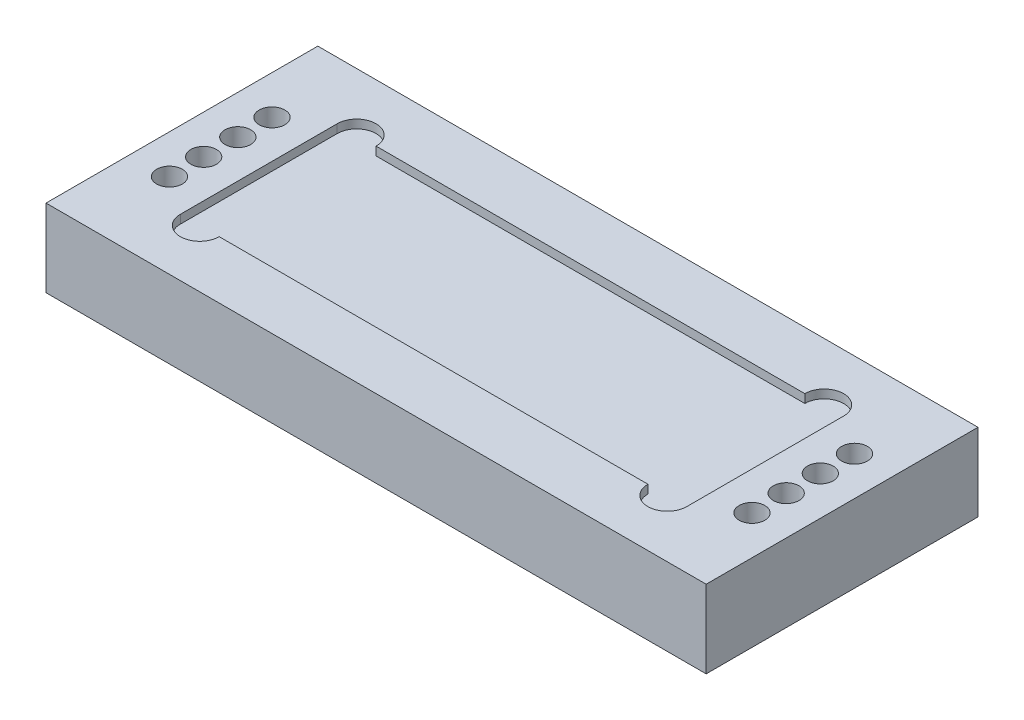
ISO-10303-21;
HEADER;
FILE_DESCRIPTION(('STEP AP214'),'2;1');
FILE_NAME('part.step','',(''),(''),'','','');
FILE_SCHEMA(('AUTOMOTIVE_DESIGN { 1 0 10303 214 1 1 1 1 }'));
ENDSEC;
DATA;
#1=APPLICATION_CONTEXT('core data for automotive mechanical design processes');
#2=APPLICATION_PROTOCOL_DEFINITION('international standard','automotive_design',2000,#1);
#3=PRODUCT_CONTEXT('',#1,'mechanical');
#4=PRODUCT('Part','Part','',(#3));
#5=PRODUCT_RELATED_PRODUCT_CATEGORY('part','',(#4));
#6=PRODUCT_DEFINITION_FORMATION('','',#4);
#7=PRODUCT_DEFINITION_CONTEXT('part definition',#1,'design');
#8=PRODUCT_DEFINITION('design','',#6,#7);
#9=PRODUCT_DEFINITION_SHAPE('','',#8);
#10=(LENGTH_UNIT() NAMED_UNIT(*) SI_UNIT(.MILLI.,.METRE.));
#11=(NAMED_UNIT(*) PLANE_ANGLE_UNIT() SI_UNIT($,.RADIAN.));
#12=(NAMED_UNIT(*) SI_UNIT($,.STERADIAN.) SOLID_ANGLE_UNIT());
#13=UNCERTAINTY_MEASURE_WITH_UNIT(LENGTH_MEASURE(1.E-05),#10,'distance_accuracy_value','');
#14=(GEOMETRIC_REPRESENTATION_CONTEXT(3) GLOBAL_UNCERTAINTY_ASSIGNED_CONTEXT((#13)) GLOBAL_UNIT_ASSIGNED_CONTEXT((#10,
#11,#12)) REPRESENTATION_CONTEXT('',''));
#15=CARTESIAN_POINT('',(0.,0.,0.));
#16=DIRECTION('',(0.,0.,1.));
#17=DIRECTION('',(1.,0.,0.));
#18=AXIS2_PLACEMENT_3D('',#15,#16,#17);
#19=CARTESIAN_POINT('',(-53.975,-12.7,-22.225));
#20=DIRECTION('',(-1.,0.,0.));
#21=DIRECTION('',(0.,0.,1.));
#22=AXIS2_PLACEMENT_3D('',#19,#20,#21);
#23=PLANE('',#22);
#24=DIRECTION('',(0.,0.,1.));
#25=VECTOR('',#24,1.);
#26=CARTESIAN_POINT('',(-53.975,0.,-22.225));
#27=LINE('',#26,#25);
#28=CARTESIAN_POINT('',(-53.975,0.,-22.225));
#29=VERTEX_POINT('',#28);
#30=CARTESIAN_POINT('',(-53.975,0.,22.225));
#31=VERTEX_POINT('',#30);
#32=EDGE_CURVE('E193',#29,#31,#27,.T.);
#33=ORIENTED_EDGE('',*,*,#32,.F.);
#34=DIRECTION('',(0.,1.,0.));
#35=VECTOR('',#34,1.);
#36=CARTESIAN_POINT('',(-53.975,-12.7,-22.225));
#37=LINE('',#36,#35);
#38=CARTESIAN_POINT('',(-53.975,-12.7,-22.225));
#39=VERTEX_POINT('',#38);
#40=EDGE_CURVE('E11',#39,#29,#37,.T.);
#41=ORIENTED_EDGE('',*,*,#40,.F.);
#42=DIRECTION('',(0.,0.,1.));
#43=VECTOR('',#42,1.);
#44=CARTESIAN_POINT('',(-53.975,-12.7,-22.225));
#45=LINE('',#44,#43);
#46=CARTESIAN_POINT('',(-53.975,-12.7,22.225));
#47=VERTEX_POINT('',#46);
#48=EDGE_CURVE('E205',#39,#47,#45,.T.);
#49=ORIENTED_EDGE('',*,*,#48,.T.);
#50=DIRECTION('',(0.,1.,0.));
#51=VECTOR('',#50,1.);
#52=CARTESIAN_POINT('',(-53.975,-12.7,22.225));
#53=LINE('',#52,#51);
#54=EDGE_CURVE('E38',#47,#31,#53,.T.);
#55=ORIENTED_EDGE('',*,*,#54,.T.);
#56=EDGE_LOOP('',(#33,#41,#49,#55));
#57=FACE_BOUND('',#56,.T.);
#58=ADVANCED_FACE('F35',(#57),#23,.T.);
#59=CARTESIAN_POINT('',(-53.975,-12.7,-22.225));
#60=DIRECTION('',(0.,0.,-1.));
#61=DIRECTION('',(-1.,0.,0.));
#62=AXIS2_PLACEMENT_3D('',#59,#60,#61);
#63=PLANE('',#62);
#64=DIRECTION('',(-1.,0.,0.));
#65=VECTOR('',#64,1.);
#66=CARTESIAN_POINT('',(-53.975,0.,-22.225));
#67=LINE('',#66,#65);
#68=CARTESIAN_POINT('',(53.975,0.,-22.225));
#69=VERTEX_POINT('',#68);
#70=EDGE_CURVE('E208',#69,#29,#67,.T.);
#71=ORIENTED_EDGE('',*,*,#70,.F.);
#72=DIRECTION('',(0.,1.,0.));
#73=VECTOR('',#72,1.);
#74=CARTESIAN_POINT('',(53.975,-12.7,-22.225));
#75=LINE('',#74,#73);
#76=CARTESIAN_POINT('',(53.975,-12.7,-22.225));
#77=VERTEX_POINT('',#76);
#78=EDGE_CURVE('E43',#77,#69,#75,.T.);
#79=ORIENTED_EDGE('',*,*,#78,.F.);
#80=DIRECTION('',(-1.,0.,0.));
#81=VECTOR('',#80,1.);
#82=CARTESIAN_POINT('',(-53.975,-12.7,-22.225));
#83=LINE('',#82,#81);
#84=EDGE_CURVE('E213',#77,#39,#83,.T.);
#85=ORIENTED_EDGE('',*,*,#84,.T.);
#86=ORIENTED_EDGE('',*,*,#40,.T.);
#87=EDGE_LOOP('',(#71,#79,#85,#86));
#88=FACE_BOUND('',#87,.T.);
#89=ADVANCED_FACE('F230',(#88),#63,.T.);
#90=CARTESIAN_POINT('',(53.975,-12.7,-22.225));
#91=DIRECTION('',(1.,0.,0.));
#92=DIRECTION('',(0.,0.,-1.));
#93=AXIS2_PLACEMENT_3D('',#90,#91,#92);
#94=PLANE('',#93);
#95=DIRECTION('',(0.,0.,-1.));
#96=VECTOR('',#95,1.);
#97=CARTESIAN_POINT('',(53.975,0.,-22.225));
#98=LINE('',#97,#96);
#99=CARTESIAN_POINT('',(53.975,0.,22.225));
#100=VERTEX_POINT('',#99);
#101=EDGE_CURVE('E220',#100,#69,#98,.T.);
#102=ORIENTED_EDGE('',*,*,#101,.F.);
#103=DIRECTION('',(0.,1.,0.));
#104=VECTOR('',#103,1.);
#105=CARTESIAN_POINT('',(53.975,-12.7,22.225));
#106=LINE('',#105,#104);
#107=CARTESIAN_POINT('',(53.975,-12.7,22.225));
#108=VERTEX_POINT('',#107);
#109=EDGE_CURVE('E225',#108,#100,#106,.T.);
#110=ORIENTED_EDGE('',*,*,#109,.F.);
#111=DIRECTION('',(0.,0.,-1.));
#112=VECTOR('',#111,1.);
#113=CARTESIAN_POINT('',(53.975,-12.7,-22.225));
#114=LINE('',#113,#112);
#115=EDGE_CURVE('E210',#108,#77,#114,.T.);
#116=ORIENTED_EDGE('',*,*,#115,.T.);
#117=ORIENTED_EDGE('',*,*,#78,.T.);
#118=EDGE_LOOP('',(#102,#110,#116,#117));
#119=FACE_BOUND('',#118,.T.);
#120=ADVANCED_FACE('F234',(#119),#94,.T.);
#121=CARTESIAN_POINT('',(-53.975,-12.7,22.225));
#122=DIRECTION('',(0.,0.,1.));
#123=DIRECTION('',(1.,0.,0.));
#124=AXIS2_PLACEMENT_3D('',#121,#122,#123);
#125=PLANE('',#124);
#126=DIRECTION('',(1.,0.,0.));
#127=VECTOR('',#126,1.);
#128=CARTESIAN_POINT('',(-53.975,0.,22.225));
#129=LINE('',#128,#127);
#130=EDGE_CURVE('E217',#31,#100,#129,.T.);
#131=ORIENTED_EDGE('',*,*,#130,.F.);
#132=ORIENTED_EDGE('',*,*,#54,.F.);
#133=DIRECTION('',(1.,0.,0.));
#134=VECTOR('',#133,1.);
#135=CARTESIAN_POINT('',(-53.975,-12.7,22.225));
#136=LINE('',#135,#134);
#137=EDGE_CURVE('E207',#47,#108,#136,.T.);
#138=ORIENTED_EDGE('',*,*,#137,.T.);
#139=ORIENTED_EDGE('',*,*,#109,.T.);
#140=EDGE_LOOP('',(#131,#132,#138,#139));
#141=FACE_BOUND('',#140,.T.);
#142=ADVANCED_FACE('F227',(#141),#125,.T.);
#143=CARTESIAN_POINT('',(0.,-12.7,0.));
#144=DIRECTION('',(0.,1.,0.));
#145=DIRECTION('',(0.,0.,1.));
#146=AXIS2_PLACEMENT_3D('',#143,#144,#145);
#147=PLANE('',#146);
#148=CARTESIAN_POINT('',(-47.625,-12.7,-8.382));
#149=DIRECTION('',(0.,1.,0.));
#150=DIRECTION('',(0.,0.,1.));
#151=AXIS2_PLACEMENT_3D('',#148,#149,#150);
#152=CIRCLE('',#151,2.1);
#153=CARTESIAN_POINT('',(-47.625,-12.7,-6.282));
#154=VERTEX_POINT('',#153);
#155=EDGE_CURVE('E459',#154,#154,#152,.T.);
#156=ORIENTED_EDGE('',*,*,#155,.T.);
#157=EDGE_LOOP('',(#156));
#158=FACE_BOUND('',#157,.T.);
#159=CARTESIAN_POINT('',(-47.625,-12.7,-2.794));
#160=DIRECTION('',(0.,1.,0.));
#161=DIRECTION('',(0.,0.,1.));
#162=AXIS2_PLACEMENT_3D('',#159,#160,#161);
#163=CIRCLE('',#162,2.1);
#164=CARTESIAN_POINT('',(-47.625,-12.7,-0.693999999999999));
#165=VERTEX_POINT('',#164);
#166=EDGE_CURVE('E469',#165,#165,#163,.T.);
#167=ORIENTED_EDGE('',*,*,#166,.T.);
#168=EDGE_LOOP('',(#167));
#169=FACE_BOUND('',#168,.T.);
#170=CARTESIAN_POINT('',(-47.625,-12.7,2.794));
#171=DIRECTION('',(0.,1.,0.));
#172=DIRECTION('',(0.,0.,1.));
#173=AXIS2_PLACEMENT_3D('',#170,#171,#172);
#174=CIRCLE('',#173,2.1);
#175=CARTESIAN_POINT('',(-47.625,-12.7,4.894));
#176=VERTEX_POINT('',#175);
#177=EDGE_CURVE('E475',#176,#176,#174,.T.);
#178=ORIENTED_EDGE('',*,*,#177,.T.);
#179=EDGE_LOOP('',(#178));
#180=FACE_BOUND('',#179,.T.);
#181=CARTESIAN_POINT('',(-47.625,-12.7,8.382));
#182=DIRECTION('',(0.,1.,0.));
#183=DIRECTION('',(0.,0.,1.));
#184=AXIS2_PLACEMENT_3D('',#181,#182,#183);
#185=CIRCLE('',#184,2.1);
#186=CARTESIAN_POINT('',(-47.625,-12.7,10.482));
#187=VERTEX_POINT('',#186);
#188=EDGE_CURVE('E481',#187,#187,#185,.T.);
#189=ORIENTED_EDGE('',*,*,#188,.T.);
#190=EDGE_LOOP('',(#189));
#191=FACE_BOUND('',#190,.T.);
#192=CARTESIAN_POINT('',(47.625,-12.7,8.382));
#193=DIRECTION('',(0.,1.,0.));
#194=DIRECTION('',(0.,0.,1.));
#195=AXIS2_PLACEMENT_3D('',#192,#193,#194);
#196=CIRCLE('',#195,2.1);
#197=CARTESIAN_POINT('',(47.625,-12.7,10.482));
#198=VERTEX_POINT('',#197);
#199=EDGE_CURVE('E487',#198,#198,#196,.T.);
#200=ORIENTED_EDGE('',*,*,#199,.T.);
#201=EDGE_LOOP('',(#200));
#202=FACE_BOUND('',#201,.T.);
#203=CARTESIAN_POINT('',(47.625,-12.7,2.794));
#204=DIRECTION('',(0.,1.,0.));
#205=DIRECTION('',(0.,0.,1.));
#206=AXIS2_PLACEMENT_3D('',#203,#204,#205);
#207=CIRCLE('',#206,2.1);
#208=CARTESIAN_POINT('',(47.625,-12.7,4.894));
#209=VERTEX_POINT('',#208);
#210=EDGE_CURVE('E493',#209,#209,#207,.T.);
#211=ORIENTED_EDGE('',*,*,#210,.T.);
#212=EDGE_LOOP('',(#211));
#213=FACE_BOUND('',#212,.T.);
#214=CARTESIAN_POINT('',(47.625,-12.7,-2.794));
#215=DIRECTION('',(0.,1.,0.));
#216=DIRECTION('',(0.,0.,1.));
#217=AXIS2_PLACEMENT_3D('',#214,#215,#216);
#218=CIRCLE('',#217,2.1);
#219=CARTESIAN_POINT('',(47.625,-12.7,-0.693999999999999));
#220=VERTEX_POINT('',#219);
#221=EDGE_CURVE('E499',#220,#220,#218,.T.);
#222=ORIENTED_EDGE('',*,*,#221,.T.);
#223=EDGE_LOOP('',(#222));
#224=FACE_BOUND('',#223,.T.);
#225=CARTESIAN_POINT('',(47.625,-12.7,-8.382));
#226=DIRECTION('',(0.,1.,0.));
#227=DIRECTION('',(0.,0.,1.));
#228=AXIS2_PLACEMENT_3D('',#225,#226,#227);
#229=CIRCLE('',#228,2.1);
#230=CARTESIAN_POINT('',(47.625,-12.7,-6.282));
#231=VERTEX_POINT('',#230);
#232=EDGE_CURVE('E158',#231,#231,#229,.T.);
#233=ORIENTED_EDGE('',*,*,#232,.T.);
#234=EDGE_LOOP('',(#233));
#235=FACE_BOUND('',#234,.T.);
#236=ORIENTED_EDGE('',*,*,#48,.F.);
#237=ORIENTED_EDGE('',*,*,#84,.F.);
#238=ORIENTED_EDGE('',*,*,#115,.F.);
#239=ORIENTED_EDGE('',*,*,#137,.F.);
#240=EDGE_LOOP('',(#236,#237,#238,#239));
#241=FACE_BOUND('',#240,.T.);
#242=ADVANCED_FACE('F236',(#158,#169,#180,#191,#202,#213,#224,#235,#241),#147,.F.);
#243=CARTESIAN_POINT('',(0.,0.,0.));
#244=DIRECTION('',(0.,1.,0.));
#245=DIRECTION('',(0.,0.,1.));
#246=AXIS2_PLACEMENT_3D('',#243,#244,#245);
#247=PLANE('',#246);
#248=CARTESIAN_POINT('',(-47.625,0.,-8.382));
#249=DIRECTION('',(0.,1.,0.));
#250=DIRECTION('',(0.,0.,1.));
#251=AXIS2_PLACEMENT_3D('',#248,#249,#250);
#252=CIRCLE('',#251,2.1);
#253=CARTESIAN_POINT('',(-47.625,0.,-6.282));
#254=VERTEX_POINT('',#253);
#255=EDGE_CURVE('E462',#254,#254,#252,.T.);
#256=ORIENTED_EDGE('',*,*,#255,.F.);
#257=EDGE_LOOP('',(#256));
#258=FACE_BOUND('',#257,.T.);
#259=CARTESIAN_POINT('',(-47.625,0.,-2.794));
#260=DIRECTION('',(0.,1.,0.));
#261=DIRECTION('',(0.,0.,1.));
#262=AXIS2_PLACEMENT_3D('',#259,#260,#261);
#263=CIRCLE('',#262,2.1);
#264=CARTESIAN_POINT('',(-47.625,0.,-0.693999999999999));
#265=VERTEX_POINT('',#264);
#266=EDGE_CURVE('E464',#265,#265,#263,.T.);
#267=ORIENTED_EDGE('',*,*,#266,.F.);
#268=EDGE_LOOP('',(#267));
#269=FACE_BOUND('',#268,.T.);
#270=CARTESIAN_POINT('',(-47.625,0.,2.794));
#271=DIRECTION('',(0.,1.,0.));
#272=DIRECTION('',(0.,0.,1.));
#273=AXIS2_PLACEMENT_3D('',#270,#271,#272);
#274=CIRCLE('',#273,2.1);
#275=CARTESIAN_POINT('',(-47.625,0.,4.894));
#276=VERTEX_POINT('',#275);
#277=EDGE_CURVE('E472',#276,#276,#274,.T.);
#278=ORIENTED_EDGE('',*,*,#277,.F.);
#279=EDGE_LOOP('',(#278));
#280=FACE_BOUND('',#279,.T.);
#281=CARTESIAN_POINT('',(-47.625,0.,8.382));
#282=DIRECTION('',(0.,1.,0.));
#283=DIRECTION('',(0.,0.,1.));
#284=AXIS2_PLACEMENT_3D('',#281,#282,#283);
#285=CIRCLE('',#284,2.1);
#286=CARTESIAN_POINT('',(-47.625,0.,10.482));
#287=VERTEX_POINT('',#286);
#288=EDGE_CURVE('E478',#287,#287,#285,.T.);
#289=ORIENTED_EDGE('',*,*,#288,.F.);
#290=EDGE_LOOP('',(#289));
#291=FACE_BOUND('',#290,.T.);
#292=CARTESIAN_POINT('',(47.625,0.,8.382));
#293=DIRECTION('',(0.,1.,0.));
#294=DIRECTION('',(0.,0.,1.));
#295=AXIS2_PLACEMENT_3D('',#292,#293,#294);
#296=CIRCLE('',#295,2.1);
#297=CARTESIAN_POINT('',(47.625,0.,10.482));
#298=VERTEX_POINT('',#297);
#299=EDGE_CURVE('E484',#298,#298,#296,.T.);
#300=ORIENTED_EDGE('',*,*,#299,.F.);
#301=EDGE_LOOP('',(#300));
#302=FACE_BOUND('',#301,.T.);
#303=CARTESIAN_POINT('',(47.625,0.,2.794));
#304=DIRECTION('',(0.,1.,0.));
#305=DIRECTION('',(0.,0.,1.));
#306=AXIS2_PLACEMENT_3D('',#303,#304,#305);
#307=CIRCLE('',#306,2.1);
#308=CARTESIAN_POINT('',(47.625,0.,4.894));
#309=VERTEX_POINT('',#308);
#310=EDGE_CURVE('E490',#309,#309,#307,.T.);
#311=ORIENTED_EDGE('',*,*,#310,.F.);
#312=EDGE_LOOP('',(#311));
#313=FACE_BOUND('',#312,.T.);
#314=CARTESIAN_POINT('',(47.625,0.,-2.794));
#315=DIRECTION('',(0.,1.,0.));
#316=DIRECTION('',(0.,0.,1.));
#317=AXIS2_PLACEMENT_3D('',#314,#315,#316);
#318=CIRCLE('',#317,2.1);
#319=CARTESIAN_POINT('',(47.625,0.,-0.693999999999999));
#320=VERTEX_POINT('',#319);
#321=EDGE_CURVE('E496',#320,#320,#318,.T.);
#322=ORIENTED_EDGE('',*,*,#321,.F.);
#323=EDGE_LOOP('',(#322));
#324=FACE_BOUND('',#323,.T.);
#325=CARTESIAN_POINT('',(47.625,0.,-8.382));
#326=DIRECTION('',(0.,1.,0.));
#327=DIRECTION('',(0.,0.,1.));
#328=AXIS2_PLACEMENT_3D('',#325,#326,#327);
#329=CIRCLE('',#328,2.1);
#330=CARTESIAN_POINT('',(47.625,0.,-6.282));
#331=VERTEX_POINT('',#330);
#332=EDGE_CURVE('E501',#331,#331,#329,.T.);
#333=ORIENTED_EDGE('',*,*,#332,.F.);
#334=EDGE_LOOP('',(#333));
#335=FACE_BOUND('',#334,.T.);
#336=CARTESIAN_POINT('',(38.227,0.,-12.827));
#337=DIRECTION('',(0.,1.,0.));
#338=DIRECTION('',(0.,0.,1.));
#339=AXIS2_PLACEMENT_3D('',#336,#337,#338);
#340=CIRCLE('',#339,3.175);
#341=CARTESIAN_POINT('',(41.402,0.,-12.827));
#342=VERTEX_POINT('',#341);
#343=CARTESIAN_POINT('',(35.052,0.,-12.827));
#344=VERTEX_POINT('',#343);
#345=EDGE_CURVE('E51',#342,#344,#340,.T.);
#346=ORIENTED_EDGE('',*,*,#345,.F.);
#347=DIRECTION('',(0.,0.,-1.));
#348=VECTOR('',#347,1.);
#349=CARTESIAN_POINT('',(41.402,0.,-12.827));
#350=LINE('',#349,#348);
#351=CARTESIAN_POINT('',(41.402,0.,12.827));
#352=VERTEX_POINT('',#351);
#353=EDGE_CURVE('E152',#352,#342,#350,.T.);
#354=ORIENTED_EDGE('',*,*,#353,.F.);
#355=CARTESIAN_POINT('',(38.227,0.,12.827));
#356=DIRECTION('',(0.,1.,0.));
#357=DIRECTION('',(0.,0.,1.));
#358=AXIS2_PLACEMENT_3D('',#355,#356,#357);
#359=CIRCLE('',#358,3.175);
#360=CARTESIAN_POINT('',(35.052,0.,12.827));
#361=VERTEX_POINT('',#360);
#362=EDGE_CURVE('E155',#361,#352,#359,.T.);
#363=ORIENTED_EDGE('',*,*,#362,.F.);
#364=DIRECTION('',(1.,0.,0.));
#365=VECTOR('',#364,1.);
#366=CARTESIAN_POINT('',(-35.052,0.,12.827));
#367=LINE('',#366,#365);
#368=CARTESIAN_POINT('',(-35.052,0.,12.827));
#369=VERTEX_POINT('',#368);
#370=EDGE_CURVE('E186',#369,#361,#367,.T.);
#371=ORIENTED_EDGE('',*,*,#370,.F.);
#372=CARTESIAN_POINT('',(-38.227,0.,12.827));
#373=DIRECTION('',(0.,1.,0.));
#374=DIRECTION('',(0.,0.,1.));
#375=AXIS2_PLACEMENT_3D('',#372,#373,#374);
#376=CIRCLE('',#375,3.175);
#377=CARTESIAN_POINT('',(-41.402,0.,12.827));
#378=VERTEX_POINT('',#377);
#379=EDGE_CURVE('E183',#378,#369,#376,.T.);
#380=ORIENTED_EDGE('',*,*,#379,.F.);
#381=DIRECTION('',(0.,0.,1.));
#382=VECTOR('',#381,1.);
#383=CARTESIAN_POINT('',(-41.402,0.,-12.827));
#384=LINE('',#383,#382);
#385=CARTESIAN_POINT('',(-41.402,0.,-12.827));
#386=VERTEX_POINT('',#385);
#387=EDGE_CURVE('E180',#386,#378,#384,.T.);
#388=ORIENTED_EDGE('',*,*,#387,.F.);
#389=CARTESIAN_POINT('',(-38.227,0.,-12.827));
#390=DIRECTION('',(0.,1.,0.));
#391=DIRECTION('',(0.,0.,1.));
#392=AXIS2_PLACEMENT_3D('',#389,#390,#391);
#393=CIRCLE('',#392,3.175);
#394=CARTESIAN_POINT('',(-35.052,0.,-12.827));
#395=VERTEX_POINT('',#394);
#396=EDGE_CURVE('E177',#395,#386,#393,.T.);
#397=ORIENTED_EDGE('',*,*,#396,.F.);
#398=DIRECTION('',(-1.,0.,0.));
#399=VECTOR('',#398,1.);
#400=CARTESIAN_POINT('',(-35.052,0.,-12.827));
#401=LINE('',#400,#399);
#402=EDGE_CURVE('E175',#344,#395,#401,.T.);
#403=ORIENTED_EDGE('',*,*,#402,.F.);
#404=EDGE_LOOP('',(#346,#354,#363,#371,#380,#388,#397,#403));
#405=FACE_BOUND('',#404,.T.);
#406=ORIENTED_EDGE('',*,*,#32,.T.);
#407=ORIENTED_EDGE('',*,*,#130,.T.);
#408=ORIENTED_EDGE('',*,*,#101,.T.);
#409=ORIENTED_EDGE('',*,*,#70,.T.);
#410=EDGE_LOOP('',(#406,#407,#408,#409));
#411=FACE_BOUND('',#410,.T.);
#412=ADVANCED_FACE('F229',(#258,#269,#280,#291,#302,#313,#324,#335,#405,#411),#247,.T.);
#413=CARTESIAN_POINT('',(38.227,-1.397,-12.827));
#414=DIRECTION('',(0.,1.,0.));
#415=DIRECTION('',(0.,0.,1.));
#416=AXIS2_PLACEMENT_3D('',#413,#414,#415);
#417=CYLINDRICAL_SURFACE('',#416,3.175);
#418=ORIENTED_EDGE('',*,*,#345,.T.);
#419=DIRECTION('',(0.,1.,0.));
#420=VECTOR('',#419,1.);
#421=CARTESIAN_POINT('',(35.052,-1.397,-12.827));
#422=LINE('',#421,#420);
#423=CARTESIAN_POINT('',(35.052,-1.397,-12.827));
#424=VERTEX_POINT('',#423);
#425=EDGE_CURVE('E129',#424,#344,#422,.T.);
#426=ORIENTED_EDGE('',*,*,#425,.F.);
#427=CARTESIAN_POINT('',(38.227,-1.397,-12.827));
#428=DIRECTION('',(0.,1.,0.));
#429=DIRECTION('',(0.,0.,1.));
#430=AXIS2_PLACEMENT_3D('',#427,#428,#429);
#431=CIRCLE('',#430,3.175);
#432=CARTESIAN_POINT('',(41.402,-1.397,-12.827));
#433=VERTEX_POINT('',#432);
#434=EDGE_CURVE('E133',#433,#424,#431,.T.);
#435=ORIENTED_EDGE('',*,*,#434,.F.);
#436=DIRECTION('',(0.,1.,0.));
#437=VECTOR('',#436,1.);
#438=CARTESIAN_POINT('',(41.402,-1.397,-12.827));
#439=LINE('',#438,#437);
#440=EDGE_CURVE('E191',#433,#342,#439,.T.);
#441=ORIENTED_EDGE('',*,*,#440,.T.);
#442=EDGE_LOOP('',(#418,#426,#435,#441));
#443=FACE_BOUND('',#442,.T.);
#444=ADVANCED_FACE('F131',(#443),#417,.F.);
#445=CARTESIAN_POINT('',(41.402,-1.397,-12.827));
#446=DIRECTION('',(1.,0.,0.));
#447=DIRECTION('',(0.,0.,-1.));
#448=AXIS2_PLACEMENT_3D('',#445,#446,#447);
#449=PLANE('',#448);
#450=ORIENTED_EDGE('',*,*,#353,.T.);
#451=ORIENTED_EDGE('',*,*,#440,.F.);
#452=DIRECTION('',(0.,0.,-1.));
#453=VECTOR('',#452,1.);
#454=CARTESIAN_POINT('',(41.402,-1.397,-12.827));
#455=LINE('',#454,#453);
#456=CARTESIAN_POINT('',(41.402,-1.397,12.827));
#457=VERTEX_POINT('',#456);
#458=EDGE_CURVE('E139',#457,#433,#455,.T.);
#459=ORIENTED_EDGE('',*,*,#458,.F.);
#460=DIRECTION('',(0.,1.,0.));
#461=VECTOR('',#460,1.);
#462=CARTESIAN_POINT('',(41.402,-1.397,12.827));
#463=LINE('',#462,#461);
#464=EDGE_CURVE('E194',#457,#352,#463,.T.);
#465=ORIENTED_EDGE('',*,*,#464,.T.);
#466=EDGE_LOOP('',(#450,#451,#459,#465));
#467=FACE_BOUND('',#466,.T.);
#468=ADVANCED_FACE('F274',(#467),#449,.F.);
#469=CARTESIAN_POINT('',(38.227,-1.397,12.827));
#470=DIRECTION('',(0.,1.,0.));
#471=DIRECTION('',(0.,0.,1.));
#472=AXIS2_PLACEMENT_3D('',#469,#470,#471);
#473=CYLINDRICAL_SURFACE('',#472,3.175);
#474=ORIENTED_EDGE('',*,*,#362,.T.);
#475=ORIENTED_EDGE('',*,*,#464,.F.);
#476=CARTESIAN_POINT('',(38.227,-1.397,12.827));
#477=DIRECTION('',(0.,1.,0.));
#478=DIRECTION('',(0.,0.,1.));
#479=AXIS2_PLACEMENT_3D('',#476,#477,#478);
#480=CIRCLE('',#479,3.175);
#481=CARTESIAN_POINT('',(35.052,-1.397,12.827));
#482=VERTEX_POINT('',#481);
#483=EDGE_CURVE('E171',#482,#457,#480,.T.);
#484=ORIENTED_EDGE('',*,*,#483,.F.);
#485=DIRECTION('',(0.,1.,0.));
#486=VECTOR('',#485,1.);
#487=CARTESIAN_POINT('',(35.052,-1.397,12.827));
#488=LINE('',#487,#486);
#489=EDGE_CURVE('E196',#482,#361,#488,.T.);
#490=ORIENTED_EDGE('',*,*,#489,.T.);
#491=EDGE_LOOP('',(#474,#475,#484,#490));
#492=FACE_BOUND('',#491,.T.);
#493=ADVANCED_FACE('F283',(#492),#473,.F.);
#494=CARTESIAN_POINT('',(-35.052,-1.397,12.827));
#495=DIRECTION('',(0.,0.,1.));
#496=DIRECTION('',(1.,0.,0.));
#497=AXIS2_PLACEMENT_3D('',#494,#495,#496);
#498=PLANE('',#497);
#499=ORIENTED_EDGE('',*,*,#370,.T.);
#500=ORIENTED_EDGE('',*,*,#489,.F.);
#501=DIRECTION('',(1.,0.,0.));
#502=VECTOR('',#501,1.);
#503=CARTESIAN_POINT('',(-35.052,-1.397,12.827));
#504=LINE('',#503,#502);
#505=CARTESIAN_POINT('',(-35.052,-1.397,12.827));
#506=VERTEX_POINT('',#505);
#507=EDGE_CURVE('E168',#506,#482,#504,.T.);
#508=ORIENTED_EDGE('',*,*,#507,.F.);
#509=DIRECTION('',(0.,1.,0.));
#510=VECTOR('',#509,1.);
#511=CARTESIAN_POINT('',(-35.052,-1.397,12.827));
#512=LINE('',#511,#510);
#513=EDGE_CURVE('E198',#506,#369,#512,.T.);
#514=ORIENTED_EDGE('',*,*,#513,.T.);
#515=EDGE_LOOP('',(#499,#500,#508,#514));
#516=FACE_BOUND('',#515,.T.);
#517=ADVANCED_FACE('F293',(#516),#498,.F.);
#518=CARTESIAN_POINT('',(-38.227,-1.397,12.827));
#519=DIRECTION('',(0.,1.,0.));
#520=DIRECTION('',(0.,0.,1.));
#521=AXIS2_PLACEMENT_3D('',#518,#519,#520);
#522=CYLINDRICAL_SURFACE('',#521,3.175);
#523=ORIENTED_EDGE('',*,*,#379,.T.);
#524=ORIENTED_EDGE('',*,*,#513,.F.);
#525=CARTESIAN_POINT('',(-38.227,-1.397,12.827));
#526=DIRECTION('',(0.,1.,0.));
#527=DIRECTION('',(0.,0.,1.));
#528=AXIS2_PLACEMENT_3D('',#525,#526,#527);
#529=CIRCLE('',#528,3.175);
#530=CARTESIAN_POINT('',(-41.402,-1.397,12.827));
#531=VERTEX_POINT('',#530);
#532=EDGE_CURVE('E165',#531,#506,#529,.T.);
#533=ORIENTED_EDGE('',*,*,#532,.F.);
#534=DIRECTION('',(0.,1.,0.));
#535=VECTOR('',#534,1.);
#536=CARTESIAN_POINT('',(-41.402,-1.397,12.827));
#537=LINE('',#536,#535);
#538=EDGE_CURVE('E200',#531,#378,#537,.T.);
#539=ORIENTED_EDGE('',*,*,#538,.T.);
#540=EDGE_LOOP('',(#523,#524,#533,#539));
#541=FACE_BOUND('',#540,.T.);
#542=ADVANCED_FACE('F303',(#541),#522,.F.);
#543=CARTESIAN_POINT('',(-41.402,-1.397,-12.827));
#544=DIRECTION('',(-1.,0.,0.));
#545=DIRECTION('',(0.,0.,1.));
#546=AXIS2_PLACEMENT_3D('',#543,#544,#545);
#547=PLANE('',#546);
#548=ORIENTED_EDGE('',*,*,#387,.T.);
#549=ORIENTED_EDGE('',*,*,#538,.F.);
#550=DIRECTION('',(0.,0.,1.));
#551=VECTOR('',#550,1.);
#552=CARTESIAN_POINT('',(-41.402,-1.397,-12.827));
#553=LINE('',#552,#551);
#554=CARTESIAN_POINT('',(-41.402,-1.397,-12.827));
#555=VERTEX_POINT('',#554);
#556=EDGE_CURVE('E162',#555,#531,#553,.T.);
#557=ORIENTED_EDGE('',*,*,#556,.F.);
#558=DIRECTION('',(0.,1.,0.));
#559=VECTOR('',#558,1.);
#560=CARTESIAN_POINT('',(-41.402,-1.397,-12.827));
#561=LINE('',#560,#559);
#562=EDGE_CURVE('E202',#555,#386,#561,.T.);
#563=ORIENTED_EDGE('',*,*,#562,.T.);
#564=EDGE_LOOP('',(#548,#549,#557,#563));
#565=FACE_BOUND('',#564,.T.);
#566=ADVANCED_FACE('F313',(#565),#547,.F.);
#567=CARTESIAN_POINT('',(-38.227,-1.397,-12.827));
#568=DIRECTION('',(0.,1.,0.));
#569=DIRECTION('',(0.,0.,1.));
#570=AXIS2_PLACEMENT_3D('',#567,#568,#569);
#571=CYLINDRICAL_SURFACE('',#570,3.175);
#572=ORIENTED_EDGE('',*,*,#396,.T.);
#573=ORIENTED_EDGE('',*,*,#562,.F.);
#574=CARTESIAN_POINT('',(-38.227,-1.397,-12.827));
#575=DIRECTION('',(0.,1.,0.));
#576=DIRECTION('',(0.,0.,1.));
#577=AXIS2_PLACEMENT_3D('',#574,#575,#576);
#578=CIRCLE('',#577,3.175);
#579=CARTESIAN_POINT('',(-35.052,-1.397,-12.827));
#580=VERTEX_POINT('',#579);
#581=EDGE_CURVE('E147',#580,#555,#578,.T.);
#582=ORIENTED_EDGE('',*,*,#581,.F.);
#583=DIRECTION('',(0.,1.,0.));
#584=VECTOR('',#583,1.);
#585=CARTESIAN_POINT('',(-35.052,-1.397,-12.827));
#586=LINE('',#585,#584);
#587=EDGE_CURVE('E138',#580,#395,#586,.T.);
#588=ORIENTED_EDGE('',*,*,#587,.T.);
#589=EDGE_LOOP('',(#572,#573,#582,#588));
#590=FACE_BOUND('',#589,.T.);
#591=ADVANCED_FACE('F323',(#590),#571,.F.);
#592=CARTESIAN_POINT('',(-35.052,-1.397,-12.827));
#593=DIRECTION('',(0.,0.,-1.));
#594=DIRECTION('',(-1.,0.,0.));
#595=AXIS2_PLACEMENT_3D('',#592,#593,#594);
#596=PLANE('',#595);
#597=ORIENTED_EDGE('',*,*,#402,.T.);
#598=ORIENTED_EDGE('',*,*,#587,.F.);
#599=DIRECTION('',(-1.,0.,0.));
#600=VECTOR('',#599,1.);
#601=CARTESIAN_POINT('',(-35.052,-1.397,-12.827));
#602=LINE('',#601,#600);
#603=EDGE_CURVE('E142',#424,#580,#602,.T.);
#604=ORIENTED_EDGE('',*,*,#603,.F.);
#605=ORIENTED_EDGE('',*,*,#425,.T.);
#606=EDGE_LOOP('',(#597,#598,#604,#605));
#607=FACE_BOUND('',#606,.T.);
#608=ADVANCED_FACE('F143',(#607),#596,.F.);
#609=CARTESIAN_POINT('',(38.227,-1.397,-12.827));
#610=DIRECTION('',(0.,1.,0.));
#611=DIRECTION('',(0.,0.,1.));
#612=AXIS2_PLACEMENT_3D('',#609,#610,#611);
#613=PLANE('',#612);
#614=ORIENTED_EDGE('',*,*,#434,.T.);
#615=ORIENTED_EDGE('',*,*,#603,.T.);
#616=ORIENTED_EDGE('',*,*,#581,.T.);
#617=ORIENTED_EDGE('',*,*,#556,.T.);
#618=ORIENTED_EDGE('',*,*,#532,.T.);
#619=ORIENTED_EDGE('',*,*,#507,.T.);
#620=ORIENTED_EDGE('',*,*,#483,.T.);
#621=ORIENTED_EDGE('',*,*,#458,.T.);
#622=EDGE_LOOP('',(#614,#615,#616,#617,#618,#619,#620,#621));
#623=FACE_BOUND('',#622,.T.);
#624=ADVANCED_FACE('F149',(#623),#613,.T.);
#625=CARTESIAN_POINT('',(47.625,0.,-8.382));
#626=DIRECTION('',(0.,1.,0.));
#627=DIRECTION('',(0.,0.,1.));
#628=AXIS2_PLACEMENT_3D('',#625,#626,#627);
#629=CYLINDRICAL_SURFACE('',#628,2.1);
#630=ORIENTED_EDGE('',*,*,#232,.F.);
#631=EDGE_LOOP('',(#630));
#632=FACE_BOUND('',#631,.T.);
#633=ORIENTED_EDGE('',*,*,#332,.T.);
#634=EDGE_LOOP('',(#633));
#635=FACE_BOUND('',#634,.T.);
#636=ADVANCED_FACE('F349',(#632,#635),#629,.F.);
#637=CARTESIAN_POINT('',(47.625,0.,-2.794));
#638=DIRECTION('',(0.,1.,0.));
#639=DIRECTION('',(0.,0.,1.));
#640=AXIS2_PLACEMENT_3D('',#637,#638,#639);
#641=CYLINDRICAL_SURFACE('',#640,2.1);
#642=ORIENTED_EDGE('',*,*,#221,.F.);
#643=EDGE_LOOP('',(#642));
#644=FACE_BOUND('',#643,.T.);
#645=ORIENTED_EDGE('',*,*,#321,.T.);
#646=EDGE_LOOP('',(#645));
#647=FACE_BOUND('',#646,.T.);
#648=ADVANCED_FACE('F368',(#644,#647),#641,.F.);
#649=CARTESIAN_POINT('',(47.625,0.,2.794));
#650=DIRECTION('',(0.,1.,0.));
#651=DIRECTION('',(0.,0.,1.));
#652=AXIS2_PLACEMENT_3D('',#649,#650,#651);
#653=CYLINDRICAL_SURFACE('',#652,2.1);
#654=ORIENTED_EDGE('',*,*,#210,.F.);
#655=EDGE_LOOP('',(#654));
#656=FACE_BOUND('',#655,.T.);
#657=ORIENTED_EDGE('',*,*,#310,.T.);
#658=EDGE_LOOP('',(#657));
#659=FACE_BOUND('',#658,.T.);
#660=ADVANCED_FACE('F379',(#656,#659),#653,.F.);
#661=CARTESIAN_POINT('',(47.625,0.,8.382));
#662=DIRECTION('',(0.,1.,0.));
#663=DIRECTION('',(0.,0.,1.));
#664=AXIS2_PLACEMENT_3D('',#661,#662,#663);
#665=CYLINDRICAL_SURFACE('',#664,2.1);
#666=ORIENTED_EDGE('',*,*,#199,.F.);
#667=EDGE_LOOP('',(#666));
#668=FACE_BOUND('',#667,.T.);
#669=ORIENTED_EDGE('',*,*,#299,.T.);
#670=EDGE_LOOP('',(#669));
#671=FACE_BOUND('',#670,.T.);
#672=ADVANCED_FACE('F390',(#668,#671),#665,.F.);
#673=CARTESIAN_POINT('',(-47.625,0.,8.382));
#674=DIRECTION('',(0.,1.,0.));
#675=DIRECTION('',(0.,0.,1.));
#676=AXIS2_PLACEMENT_3D('',#673,#674,#675);
#677=CYLINDRICAL_SURFACE('',#676,2.1);
#678=ORIENTED_EDGE('',*,*,#188,.F.);
#679=EDGE_LOOP('',(#678));
#680=FACE_BOUND('',#679,.T.);
#681=ORIENTED_EDGE('',*,*,#288,.T.);
#682=EDGE_LOOP('',(#681));
#683=FACE_BOUND('',#682,.T.);
#684=ADVANCED_FACE('F401',(#680,#683),#677,.F.);
#685=CARTESIAN_POINT('',(-47.625,0.,2.794));
#686=DIRECTION('',(0.,1.,0.));
#687=DIRECTION('',(0.,0.,1.));
#688=AXIS2_PLACEMENT_3D('',#685,#686,#687);
#689=CYLINDRICAL_SURFACE('',#688,2.1);
#690=ORIENTED_EDGE('',*,*,#177,.F.);
#691=EDGE_LOOP('',(#690));
#692=FACE_BOUND('',#691,.T.);
#693=ORIENTED_EDGE('',*,*,#277,.T.);
#694=EDGE_LOOP('',(#693));
#695=FACE_BOUND('',#694,.T.);
#696=ADVANCED_FACE('F412',(#692,#695),#689,.F.);
#697=CARTESIAN_POINT('',(-47.625,0.,-2.794));
#698=DIRECTION('',(0.,1.,0.));
#699=DIRECTION('',(0.,0.,1.));
#700=AXIS2_PLACEMENT_3D('',#697,#698,#699);
#701=CYLINDRICAL_SURFACE('',#700,2.1);
#702=ORIENTED_EDGE('',*,*,#166,.F.);
#703=EDGE_LOOP('',(#702));
#704=FACE_BOUND('',#703,.T.);
#705=ORIENTED_EDGE('',*,*,#266,.T.);
#706=EDGE_LOOP('',(#705));
#707=FACE_BOUND('',#706,.T.);
#708=ADVANCED_FACE('F423',(#704,#707),#701,.F.);
#709=CARTESIAN_POINT('',(-47.625,0.,-8.382));
#710=DIRECTION('',(0.,1.,0.));
#711=DIRECTION('',(0.,0.,1.));
#712=AXIS2_PLACEMENT_3D('',#709,#710,#711);
#713=CYLINDRICAL_SURFACE('',#712,2.1);
#714=ORIENTED_EDGE('',*,*,#155,.F.);
#715=EDGE_LOOP('',(#714));
#716=FACE_BOUND('',#715,.T.);
#717=ORIENTED_EDGE('',*,*,#255,.T.);
#718=EDGE_LOOP('',(#717));
#719=FACE_BOUND('',#718,.T.);
#720=ADVANCED_FACE('F434',(#716,#719),#713,.F.);
#721=CLOSED_SHELL('',(#58,#89,#120,#142,#242,#412,#444,#468,#493,#517,#542,#566,#591,#608,#624,
#636,#648,#660,#672,#684,#696,#708,#720));
#722=MANIFOLD_SOLID_BREP('B2',#721);
#723=ADVANCED_BREP_SHAPE_REPRESENTATION('',(#18,#722),#14);
#724=SHAPE_DEFINITION_REPRESENTATION(#9,#723);
ENDSEC;
END-ISO-10303-21;
